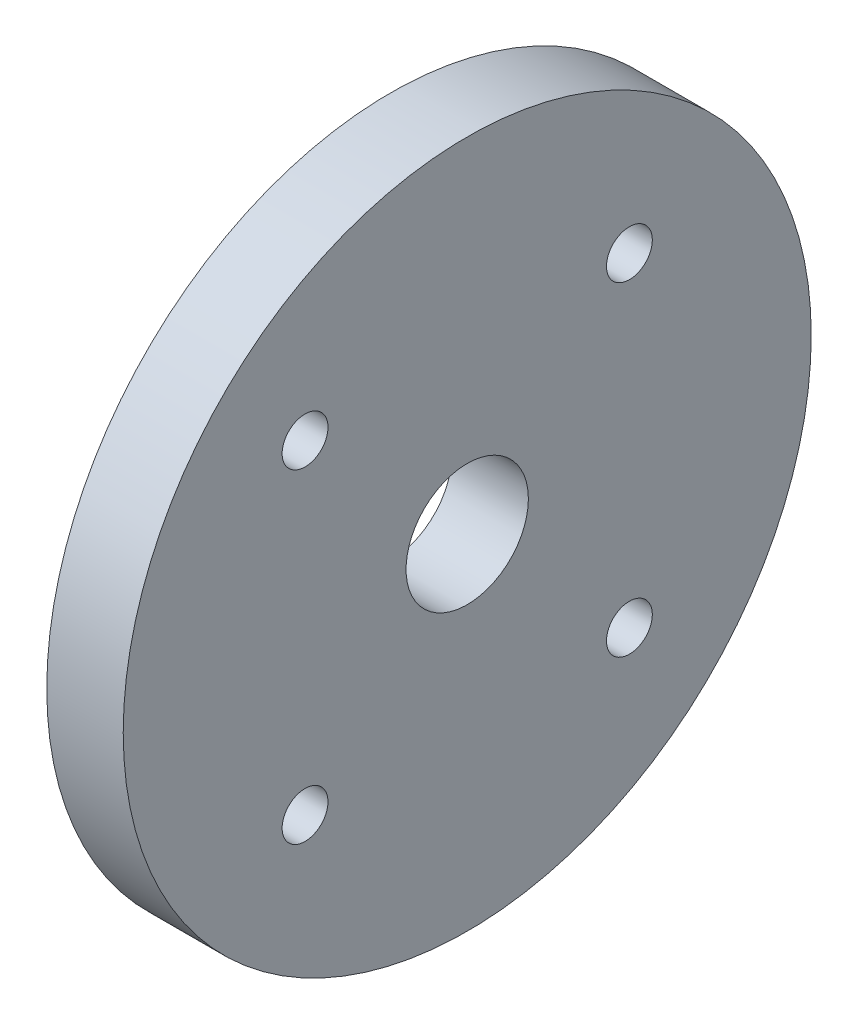
ISO-10303-21;
HEADER;
FILE_DESCRIPTION(('STEP AP214'),'2;1');
FILE_NAME('part.step','',(''),(''),'','','');
FILE_SCHEMA(('AUTOMOTIVE_DESIGN { 1 0 10303 214 1 1 1 1 }'));
ENDSEC;
DATA;
#1=APPLICATION_CONTEXT('core data for automotive mechanical design processes');
#2=APPLICATION_PROTOCOL_DEFINITION('international standard','automotive_design',2000,#1);
#3=PRODUCT_CONTEXT('',#1,'mechanical');
#4=PRODUCT('Part','Part','',(#3));
#5=PRODUCT_RELATED_PRODUCT_CATEGORY('part','',(#4));
#6=PRODUCT_DEFINITION_FORMATION('','',#4);
#7=PRODUCT_DEFINITION_CONTEXT('part definition',#1,'design');
#8=PRODUCT_DEFINITION('design','',#6,#7);
#9=PRODUCT_DEFINITION_SHAPE('','',#8);
#10=(LENGTH_UNIT() NAMED_UNIT(*) SI_UNIT(.MILLI.,.METRE.));
#11=(NAMED_UNIT(*) PLANE_ANGLE_UNIT() SI_UNIT($,.RADIAN.));
#12=(NAMED_UNIT(*) SI_UNIT($,.STERADIAN.) SOLID_ANGLE_UNIT());
#13=UNCERTAINTY_MEASURE_WITH_UNIT(LENGTH_MEASURE(1.E-05),#10,'distance_accuracy_value','');
#14=(GEOMETRIC_REPRESENTATION_CONTEXT(3) GLOBAL_UNCERTAINTY_ASSIGNED_CONTEXT((#13)) GLOBAL_UNIT_ASSIGNED_CONTEXT((#10,
#11,#12)) REPRESENTATION_CONTEXT('',''));
#15=CARTESIAN_POINT('',(0.,0.,0.));
#16=DIRECTION('',(0.,0.,1.));
#17=DIRECTION('',(1.,0.,0.));
#18=AXIS2_PLACEMENT_3D('',#15,#16,#17);
#19=CARTESIAN_POINT('',(5.,0.,0.));
#20=DIRECTION('',(1.,0.,0.));
#21=DIRECTION('',(0.,0.,-1.));
#22=AXIS2_PLACEMENT_3D('',#19,#20,#21);
#23=PLANE('',#22);
#24=CARTESIAN_POINT('',(5.,-10.6066017177982,-10.6066017177982));
#25=DIRECTION('',(1.,0.,0.));
#26=DIRECTION('',(0.,0.,-1.));
#27=AXIS2_PLACEMENT_3D('',#24,#25,#26);
#28=CIRCLE('',#27,1.5);
#29=CARTESIAN_POINT('',(5.,-10.6066017177982,-12.1066017177982));
#30=VERTEX_POINT('',#29);
#31=EDGE_CURVE('E64',#30,#30,#28,.T.);
#32=ORIENTED_EDGE('',*,*,#31,.F.);
#33=EDGE_LOOP('',(#32));
#34=FACE_BOUND('',#33,.T.);
#35=CARTESIAN_POINT('',(5.,10.6066017177982,10.6066017177982));
#36=DIRECTION('',(1.,0.,0.));
#37=DIRECTION('',(0.,0.,-1.));
#38=AXIS2_PLACEMENT_3D('',#35,#36,#37);
#39=CIRCLE('',#38,1.5);
#40=CARTESIAN_POINT('',(5.,10.6066017177982,9.10660171779824));
#41=VERTEX_POINT('',#40);
#42=EDGE_CURVE('E52',#41,#41,#39,.T.);
#43=ORIENTED_EDGE('',*,*,#42,.F.);
#44=EDGE_LOOP('',(#43));
#45=FACE_BOUND('',#44,.T.);
#46=CARTESIAN_POINT('',(5.,0.,0.));
#47=DIRECTION('',(1.,0.,0.));
#48=DIRECTION('',(0.,0.,-1.));
#49=AXIS2_PLACEMENT_3D('',#46,#47,#48);
#50=CIRCLE('',#49,22.5);
#51=CARTESIAN_POINT('',(5.,0.,-22.5));
#52=VERTEX_POINT('',#51);
#53=EDGE_CURVE('E10',#52,#52,#50,.T.);
#54=ORIENTED_EDGE('',*,*,#53,.T.);
#55=EDGE_LOOP('',(#54));
#56=FACE_BOUND('',#55,.T.);
#57=CARTESIAN_POINT('',(5.,0.,0.));
#58=DIRECTION('',(1.,0.,0.));
#59=DIRECTION('',(0.,0.,-1.));
#60=AXIS2_PLACEMENT_3D('',#57,#58,#59);
#61=CIRCLE('',#60,4.);
#62=CARTESIAN_POINT('',(5.,0.,-4.));
#63=VERTEX_POINT('',#62);
#64=EDGE_CURVE('E47',#63,#63,#61,.T.);
#65=ORIENTED_EDGE('',*,*,#64,.F.);
#66=EDGE_LOOP('',(#65));
#67=FACE_BOUND('',#66,.T.);
#68=CARTESIAN_POINT('',(5.,-10.6066017177982,10.6066017177982));
#69=DIRECTION('',(1.,0.,0.));
#70=DIRECTION('',(0.,0.,1.));
#71=AXIS2_PLACEMENT_3D('',#68,#69,#70);
#72=CIRCLE('',#71,1.5);
#73=CARTESIAN_POINT('',(5.,-10.6066017177982,12.1066017177982));
#74=VERTEX_POINT('',#73);
#75=EDGE_CURVE('E58',#74,#74,#72,.T.);
#76=ORIENTED_EDGE('',*,*,#75,.F.);
#77=EDGE_LOOP('',(#76));
#78=FACE_BOUND('',#77,.T.);
#79=CARTESIAN_POINT('',(5.,10.6066017177983,-10.6066017177981));
#80=DIRECTION('',(1.,0.,0.));
#81=DIRECTION('',(0.,0.,-1.));
#82=AXIS2_PLACEMENT_3D('',#79,#80,#81);
#83=CIRCLE('',#82,1.5);
#84=CARTESIAN_POINT('',(5.,10.6066017177983,-12.1066017177981));
#85=VERTEX_POINT('',#84);
#86=EDGE_CURVE('E70',#85,#85,#83,.T.);
#87=ORIENTED_EDGE('',*,*,#86,.F.);
#88=EDGE_LOOP('',(#87));
#89=FACE_BOUND('',#88,.T.);
#90=ADVANCED_FACE('F36',(#34,#45,#56,#67,#78,#89),#23,.T.);
#91=CARTESIAN_POINT('',(0.,0.,0.));
#92=DIRECTION('',(1.,0.,0.));
#93=DIRECTION('',(0.,0.,-1.));
#94=AXIS2_PLACEMENT_3D('',#91,#92,#93);
#95=PLANE('',#94);
#96=CARTESIAN_POINT('',(0.,0.,0.));
#97=DIRECTION('',(1.,0.,0.));
#98=DIRECTION('',(0.,0.,-1.));
#99=AXIS2_PLACEMENT_3D('',#96,#97,#98);
#100=CIRCLE('',#99,22.5);
#101=CARTESIAN_POINT('',(0.,0.,-22.5));
#102=VERTEX_POINT('',#101);
#103=EDGE_CURVE('E40',#102,#102,#100,.T.);
#104=ORIENTED_EDGE('',*,*,#103,.F.);
#105=EDGE_LOOP('',(#104));
#106=FACE_BOUND('',#105,.T.);
#107=CARTESIAN_POINT('',(0.,0.,0.));
#108=DIRECTION('',(1.,0.,0.));
#109=DIRECTION('',(0.,0.,-1.));
#110=AXIS2_PLACEMENT_3D('',#107,#108,#109);
#111=CIRCLE('',#110,4.);
#112=CARTESIAN_POINT('',(0.,0.,-4.));
#113=VERTEX_POINT('',#112);
#114=EDGE_CURVE('E49',#113,#113,#111,.T.);
#115=ORIENTED_EDGE('',*,*,#114,.T.);
#116=EDGE_LOOP('',(#115));
#117=FACE_BOUND('',#116,.T.);
#118=CARTESIAN_POINT('',(0.,10.6066017177982,10.6066017177982));
#119=DIRECTION('',(1.,0.,0.));
#120=DIRECTION('',(0.,0.,-1.));
#121=AXIS2_PLACEMENT_3D('',#118,#119,#120);
#122=CIRCLE('',#121,1.5);
#123=CARTESIAN_POINT('',(0.,10.6066017177982,9.10660171779824));
#124=VERTEX_POINT('',#123);
#125=EDGE_CURVE('E55',#124,#124,#122,.T.);
#126=ORIENTED_EDGE('',*,*,#125,.T.);
#127=EDGE_LOOP('',(#126));
#128=FACE_BOUND('',#127,.T.);
#129=CARTESIAN_POINT('',(0.,-10.6066017177982,10.6066017177982));
#130=DIRECTION('',(1.,0.,0.));
#131=DIRECTION('',(0.,0.,1.));
#132=AXIS2_PLACEMENT_3D('',#129,#130,#131);
#133=CIRCLE('',#132,1.5);
#134=CARTESIAN_POINT('',(0.,-10.6066017177982,12.1066017177982));
#135=VERTEX_POINT('',#134);
#136=EDGE_CURVE('E61',#135,#135,#133,.T.);
#137=ORIENTED_EDGE('',*,*,#136,.T.);
#138=EDGE_LOOP('',(#137));
#139=FACE_BOUND('',#138,.T.);
#140=CARTESIAN_POINT('',(0.,-10.6066017177982,-10.6066017177982));
#141=DIRECTION('',(1.,0.,0.));
#142=DIRECTION('',(0.,0.,-1.));
#143=AXIS2_PLACEMENT_3D('',#140,#141,#142);
#144=CIRCLE('',#143,1.5);
#145=CARTESIAN_POINT('',(0.,-10.6066017177982,-12.1066017177982));
#146=VERTEX_POINT('',#145);
#147=EDGE_CURVE('E67',#146,#146,#144,.T.);
#148=ORIENTED_EDGE('',*,*,#147,.T.);
#149=EDGE_LOOP('',(#148));
#150=FACE_BOUND('',#149,.T.);
#151=CARTESIAN_POINT('',(0.,10.6066017177983,-10.6066017177981));
#152=DIRECTION('',(1.,0.,0.));
#153=DIRECTION('',(0.,0.,-1.));
#154=AXIS2_PLACEMENT_3D('',#151,#152,#153);
#155=CIRCLE('',#154,1.5);
#156=CARTESIAN_POINT('',(0.,10.6066017177983,-12.1066017177981));
#157=VERTEX_POINT('',#156);
#158=EDGE_CURVE('E73',#157,#157,#155,.T.);
#159=ORIENTED_EDGE('',*,*,#158,.T.);
#160=EDGE_LOOP('',(#159));
#161=FACE_BOUND('',#160,.T.);
#162=ADVANCED_FACE('F83',(#106,#117,#128,#139,#150,#161),#95,.F.);
#163=CARTESIAN_POINT('',(5.,0.,0.));
#164=DIRECTION('',(-1.,0.,0.));
#165=DIRECTION('',(0.,0.,1.));
#166=AXIS2_PLACEMENT_3D('',#163,#164,#165);
#167=CYLINDRICAL_SURFACE('',#166,22.5);
#168=ORIENTED_EDGE('',*,*,#53,.F.);
#169=EDGE_LOOP('',(#168));
#170=FACE_BOUND('',#169,.T.);
#171=ORIENTED_EDGE('',*,*,#103,.T.);
#172=EDGE_LOOP('',(#171));
#173=FACE_BOUND('',#172,.T.);
#174=ADVANCED_FACE('F38',(#170,#173),#167,.T.);
#175=CARTESIAN_POINT('',(5.,0.,0.));
#176=DIRECTION('',(-1.,0.,0.));
#177=DIRECTION('',(0.,0.,1.));
#178=AXIS2_PLACEMENT_3D('',#175,#176,#177);
#179=CYLINDRICAL_SURFACE('',#178,4.);
#180=ORIENTED_EDGE('',*,*,#64,.T.);
#181=EDGE_LOOP('',(#180));
#182=FACE_BOUND('',#181,.T.);
#183=ORIENTED_EDGE('',*,*,#114,.F.);
#184=EDGE_LOOP('',(#183));
#185=FACE_BOUND('',#184,.T.);
#186=ADVANCED_FACE('F93',(#182,#185),#179,.F.);
#187=CARTESIAN_POINT('',(5.,10.6066017177982,10.6066017177982));
#188=DIRECTION('',(-1.,0.,0.));
#189=DIRECTION('',(0.,0.,1.));
#190=AXIS2_PLACEMENT_3D('',#187,#188,#189);
#191=CYLINDRICAL_SURFACE('',#190,1.5);
#192=ORIENTED_EDGE('',*,*,#42,.T.);
#193=EDGE_LOOP('',(#192));
#194=FACE_BOUND('',#193,.T.);
#195=ORIENTED_EDGE('',*,*,#125,.F.);
#196=EDGE_LOOP('',(#195));
#197=FACE_BOUND('',#196,.T.);
#198=ADVANCED_FACE('F96',(#194,#197),#191,.F.);
#199=CARTESIAN_POINT('',(5.,-10.6066017177982,10.6066017177982));
#200=DIRECTION('',(-1.,0.,0.));
#201=DIRECTION('',(0.,0.,1.));
#202=AXIS2_PLACEMENT_3D('',#199,#200,#201);
#203=CYLINDRICAL_SURFACE('',#202,1.5);
#204=ORIENTED_EDGE('',*,*,#75,.T.);
#205=EDGE_LOOP('',(#204));
#206=FACE_BOUND('',#205,.T.);
#207=ORIENTED_EDGE('',*,*,#136,.F.);
#208=EDGE_LOOP('',(#207));
#209=FACE_BOUND('',#208,.T.);
#210=ADVANCED_FACE('F100',(#206,#209),#203,.F.);
#211=CARTESIAN_POINT('',(5.,-10.6066017177982,-10.6066017177982));
#212=DIRECTION('',(-1.,0.,0.));
#213=DIRECTION('',(0.,0.,1.));
#214=AXIS2_PLACEMENT_3D('',#211,#212,#213);
#215=CYLINDRICAL_SURFACE('',#214,1.5);
#216=ORIENTED_EDGE('',*,*,#31,.T.);
#217=EDGE_LOOP('',(#216));
#218=FACE_BOUND('',#217,.T.);
#219=ORIENTED_EDGE('',*,*,#147,.F.);
#220=EDGE_LOOP('',(#219));
#221=FACE_BOUND('',#220,.T.);
#222=ADVANCED_FACE('F104',(#218,#221),#215,.F.);
#223=CARTESIAN_POINT('',(5.,10.6066017177983,-10.6066017177981));
#224=DIRECTION('',(-1.,0.,0.));
#225=DIRECTION('',(0.,0.,1.));
#226=AXIS2_PLACEMENT_3D('',#223,#224,#225);
#227=CYLINDRICAL_SURFACE('',#226,1.5);
#228=ORIENTED_EDGE('',*,*,#86,.T.);
#229=EDGE_LOOP('',(#228));
#230=FACE_BOUND('',#229,.T.);
#231=ORIENTED_EDGE('',*,*,#158,.F.);
#232=EDGE_LOOP('',(#231));
#233=FACE_BOUND('',#232,.T.);
#234=ADVANCED_FACE('F79',(#230,#233),#227,.F.);
#235=CLOSED_SHELL('',(#90,#162,#174,#186,#198,#210,#222,#234));
#236=MANIFOLD_SOLID_BREP('B2',#235);
#237=ADVANCED_BREP_SHAPE_REPRESENTATION('',(#18,#236),#14);
#238=SHAPE_DEFINITION_REPRESENTATION(#9,#237);
ENDSEC;
END-ISO-10303-21;
